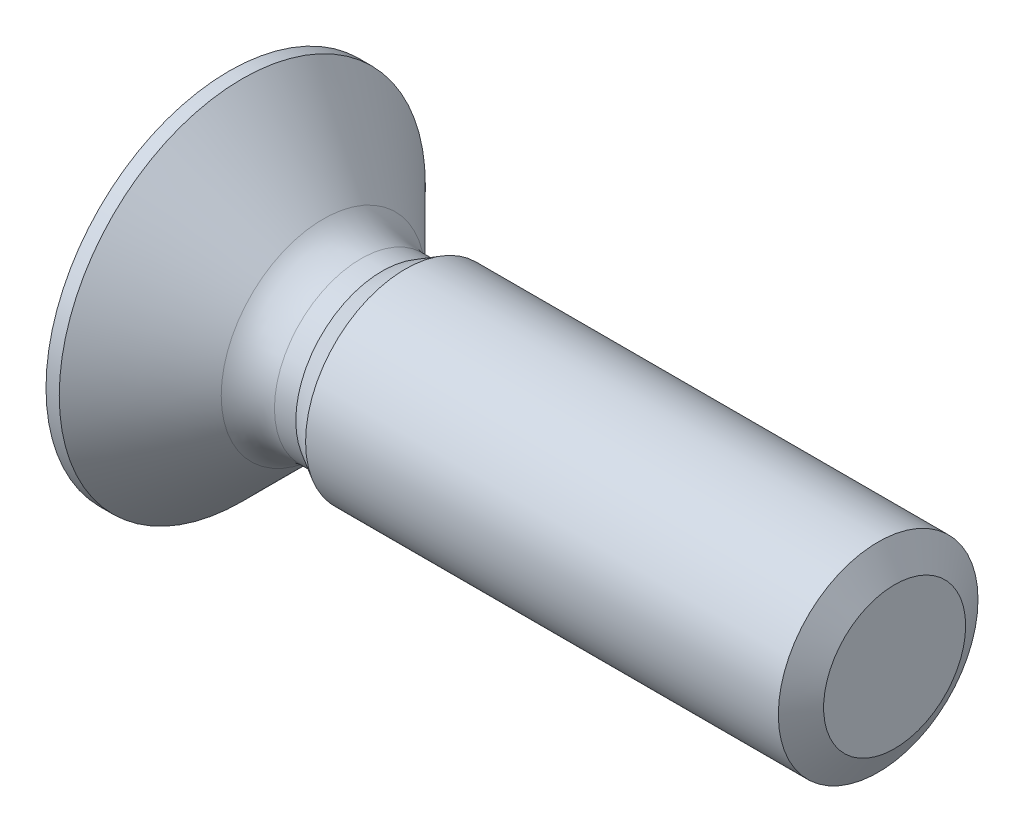
ISO-10303-21;
HEADER;
FILE_DESCRIPTION(('STEP AP214'),'2;1');
FILE_NAME('part.step','',(''),(''),'','','');
FILE_SCHEMA(('AUTOMOTIVE_DESIGN { 1 0 10303 214 1 1 1 1 }'));
ENDSEC;
DATA;
#1=APPLICATION_CONTEXT('core data for automotive mechanical design processes');
#2=APPLICATION_PROTOCOL_DEFINITION('international standard','automotive_design',2000,#1);
#3=PRODUCT_CONTEXT('',#1,'mechanical');
#4=PRODUCT('Part','Part','',(#3));
#5=PRODUCT_RELATED_PRODUCT_CATEGORY('part','',(#4));
#6=PRODUCT_DEFINITION_FORMATION('','',#4);
#7=PRODUCT_DEFINITION_CONTEXT('part definition',#1,'design');
#8=PRODUCT_DEFINITION('design','',#6,#7);
#9=PRODUCT_DEFINITION_SHAPE('','',#8);
#10=(LENGTH_UNIT() NAMED_UNIT(*) SI_UNIT(.MILLI.,.METRE.));
#11=(NAMED_UNIT(*) PLANE_ANGLE_UNIT() SI_UNIT($,.RADIAN.));
#12=(NAMED_UNIT(*) SI_UNIT($,.STERADIAN.) SOLID_ANGLE_UNIT());
#13=UNCERTAINTY_MEASURE_WITH_UNIT(LENGTH_MEASURE(1.E-05),#10,'distance_accuracy_value','');
#14=(GEOMETRIC_REPRESENTATION_CONTEXT(3) GLOBAL_UNCERTAINTY_ASSIGNED_CONTEXT((#13)) GLOBAL_UNIT_ASSIGNED_CONTEXT((#10,
#11,#12)) REPRESENTATION_CONTEXT('',''));
#15=CARTESIAN_POINT('',(0.,0.,0.));
#16=DIRECTION('',(0.,0.,1.));
#17=DIRECTION('',(1.,0.,0.));
#18=AXIS2_PLACEMENT_3D('',#15,#16,#17);
#19=CARTESIAN_POINT('',(0.,0.,0.));
#20=DIRECTION('',(1.,0.,0.));
#21=DIRECTION('',(0.,0.,-1.));
#22=AXIS2_PLACEMENT_3D('',#19,#20,#21);
#23=PLANE('',#22);
#24=CARTESIAN_POINT('',(0.,0.,0.));
#25=DIRECTION('',(-1.,0.,0.));
#26=DIRECTION('',(0.,0.,1.));
#27=AXIS2_PLACEMENT_3D('',#24,#25,#26);
#28=CIRCLE('',#27,2.75);
#29=CARTESIAN_POINT('',(0.,0.,2.75));
#30=VERTEX_POINT('',#29);
#31=EDGE_CURVE('E179',#30,#30,#28,.T.);
#32=ORIENTED_EDGE('',*,*,#31,.T.);
#33=EDGE_LOOP('',(#32));
#34=FACE_BOUND('',#33,.T.);
#35=DIRECTION('',(0.,1.,0.));
#36=VECTOR('',#35,1.);
#37=CARTESIAN_POINT('',(0.,1.6,0.250000000000006));
#38=LINE('',#37,#36);
#39=CARTESIAN_POINT('',(0.,0.25,0.250000000000001));
#40=VERTEX_POINT('',#39);
#41=CARTESIAN_POINT('',(0.,1.6,0.250000000000006));
#42=VERTEX_POINT('',#41);
#43=EDGE_CURVE('E101',#40,#42,#38,.T.);
#44=ORIENTED_EDGE('',*,*,#43,.F.);
#45=DIRECTION('',(0.,0.,-1.));
#46=VECTOR('',#45,1.);
#47=CARTESIAN_POINT('',(0.,0.25,-1.6));
#48=LINE('',#47,#46);
#49=CARTESIAN_POINT('',(0.,0.25,1.6));
#50=VERTEX_POINT('',#49);
#51=EDGE_CURVE('E146',#50,#40,#48,.T.);
#52=ORIENTED_EDGE('',*,*,#51,.F.);
#53=DIRECTION('',(0.,1.,0.));
#54=VECTOR('',#53,1.);
#55=CARTESIAN_POINT('',(0.,0.25,1.6));
#56=LINE('',#55,#54);
#57=CARTESIAN_POINT('',(0.,-0.25,1.6));
#58=VERTEX_POINT('',#57);
#59=EDGE_CURVE('E143',#58,#50,#56,.T.);
#60=ORIENTED_EDGE('',*,*,#59,.F.);
#61=DIRECTION('',(0.,0.,1.));
#62=VECTOR('',#61,1.);
#63=CARTESIAN_POINT('',(0.,-0.25,-1.6));
#64=LINE('',#63,#62);
#65=CARTESIAN_POINT('',(0.,-0.25,0.249999999999999));
#66=VERTEX_POINT('',#65);
#67=EDGE_CURVE('E74',#66,#58,#64,.T.);
#68=ORIENTED_EDGE('',*,*,#67,.F.);
#69=CARTESIAN_POINT('',(0.,-1.6,0.249999999999994));
#70=VERTEX_POINT('',#69);
#71=EDGE_CURVE('E109',#70,#66,#38,.T.);
#72=ORIENTED_EDGE('',*,*,#71,.F.);
#73=DIRECTION('',(0.,0.,1.));
#74=VECTOR('',#73,1.);
#75=CARTESIAN_POINT('',(0.,-1.6,0.249999999999994));
#76=LINE('',#75,#74);
#77=CARTESIAN_POINT('',(0.,-1.6,-0.250000000000006));
#78=VERTEX_POINT('',#77);
#79=EDGE_CURVE('E110',#78,#70,#76,.T.);
#80=ORIENTED_EDGE('',*,*,#79,.F.);
#81=DIRECTION('',(0.,-1.,0.));
#82=VECTOR('',#81,1.);
#83=CARTESIAN_POINT('',(0.,1.6,-0.249999999999994));
#84=LINE('',#83,#82);
#85=CARTESIAN_POINT('',(0.,-0.25,-0.250000000000001));
#86=VERTEX_POINT('',#85);
#87=EDGE_CURVE('E123',#86,#78,#84,.T.);
#88=ORIENTED_EDGE('',*,*,#87,.F.);
#89=CARTESIAN_POINT('',(0.,-0.25,-1.6));
#90=VERTEX_POINT('',#89);
#91=EDGE_CURVE('E140',#90,#86,#64,.T.);
#92=ORIENTED_EDGE('',*,*,#91,.F.);
#93=DIRECTION('',(0.,-1.,0.));
#94=VECTOR('',#93,1.);
#95=CARTESIAN_POINT('',(0.,0.25,-1.6));
#96=LINE('',#95,#94);
#97=CARTESIAN_POINT('',(0.,0.25,-1.6));
#98=VERTEX_POINT('',#97);
#99=EDGE_CURVE('E51',#98,#90,#96,.T.);
#100=ORIENTED_EDGE('',*,*,#99,.F.);
#101=CARTESIAN_POINT('',(0.,0.25,-0.249999999999999));
#102=VERTEX_POINT('',#101);
#103=EDGE_CURVE('E149',#102,#98,#48,.T.);
#104=ORIENTED_EDGE('',*,*,#103,.F.);
#105=CARTESIAN_POINT('',(0.,1.6,-0.249999999999994));
#106=VERTEX_POINT('',#105);
#107=EDGE_CURVE('E122',#106,#102,#84,.T.);
#108=ORIENTED_EDGE('',*,*,#107,.F.);
#109=DIRECTION('',(0.,0.,-1.));
#110=VECTOR('',#109,1.);
#111=CARTESIAN_POINT('',(0.,1.6,0.250000000000006));
#112=LINE('',#111,#110);
#113=EDGE_CURVE('E115',#42,#106,#112,.T.);
#114=ORIENTED_EDGE('',*,*,#113,.F.);
#115=EDGE_LOOP('',(#44,#52,#60,#68,#72,#80,#88,#92,#100,#104,#108,#114));
#116=FACE_BOUND('',#115,.T.);
#117=ADVANCED_FACE('F37',(#34,#116),#23,.F.);
#118=CARTESIAN_POINT('',(2.1,0.,0.));
#119=DIRECTION('',(-0.118212889785112,-0.992988274194944,0.));
#120=DIRECTION('',(0.992988274194944,-0.118212889785112,0.));
#121=AXIS2_PLACEMENT_3D('',#118,#119,#120);
#122=PLANE('',#121);
#123=ORIENTED_EDGE('',*,*,#51,.T.);
#124=DIRECTION('',(0.986122002690152,-0.117395476510732,-0.117395476510733));
#125=VECTOR('',#124,1.);
#126=CARTESIAN_POINT('',(2.1,0.,0.));
#127=LINE('',#126,#125);
#128=CARTESIAN_POINT('',(2.1,0.,0.));
#129=VERTEX_POINT('',#128);
#130=EDGE_CURVE('E80',#40,#129,#127,.T.);
#131=ORIENTED_EDGE('',*,*,#130,.T.);
#132=DIRECTION('',(0.791889207905293,-0.0942725247506301,-0.603344158404032));
#133=VECTOR('',#132,1.);
#134=CARTESIAN_POINT('',(0.,0.25,1.6));
#135=LINE('',#134,#133);
#136=EDGE_CURVE('E60',#50,#129,#135,.T.);
#137=ORIENTED_EDGE('',*,*,#136,.F.);
#138=EDGE_LOOP('',(#123,#131,#137));
#139=FACE_BOUND('',#138,.T.);
#140=ADVANCED_FACE('F195',(#139),#122,.T.);
#141=DIRECTION('',(0.791889207905293,-0.0942725247506301,0.603344158404032));
#142=VECTOR('',#141,1.);
#143=CARTESIAN_POINT('',(0.,0.25,-1.6));
#144=LINE('',#143,#142);
#145=EDGE_CURVE('E145',#98,#129,#144,.T.);
#146=ORIENTED_EDGE('',*,*,#145,.T.);
#147=DIRECTION('',(-0.986122002690152,0.117395476510732,-0.117395476510732));
#148=VECTOR('',#147,1.);
#149=CARTESIAN_POINT('',(2.1,0.,0.));
#150=LINE('',#149,#148);
#151=EDGE_CURVE('E127',#129,#102,#150,.T.);
#152=ORIENTED_EDGE('',*,*,#151,.T.);
#153=ORIENTED_EDGE('',*,*,#103,.T.);
#154=EDGE_LOOP('',(#146,#152,#153));
#155=FACE_BOUND('',#154,.T.);
#156=ADVANCED_FACE('F189',(#155),#122,.T.);
#157=CARTESIAN_POINT('',(2.1,0.,0.));
#158=DIRECTION('',(-0.118212889785112,0.992988274194944,0.));
#159=DIRECTION('',(-0.992988274194944,-0.118212889785112,0.));
#160=AXIS2_PLACEMENT_3D('',#157,#158,#159);
#161=PLANE('',#160);
#162=DIRECTION('',(0.791889207905293,0.0942725247506301,-0.603344158404032));
#163=VECTOR('',#162,1.);
#164=CARTESIAN_POINT('',(0.,-0.25,1.6));
#165=LINE('',#164,#163);
#166=EDGE_CURVE('E139',#58,#129,#165,.T.);
#167=ORIENTED_EDGE('',*,*,#166,.T.);
#168=DIRECTION('',(-0.986122002690152,-0.117395476510732,0.117395476510732));
#169=VECTOR('',#168,1.);
#170=CARTESIAN_POINT('',(2.1,0.,0.));
#171=LINE('',#170,#169);
#172=EDGE_CURVE('E11',#129,#66,#171,.T.);
#173=ORIENTED_EDGE('',*,*,#172,.T.);
#174=ORIENTED_EDGE('',*,*,#67,.T.);
#175=EDGE_LOOP('',(#167,#173,#174));
#176=FACE_BOUND('',#175,.T.);
#177=ADVANCED_FACE('F190',(#176),#161,.T.);
#178=ORIENTED_EDGE('',*,*,#91,.T.);
#179=DIRECTION('',(0.986122002690152,0.117395476510732,0.117395476510733));
#180=VECTOR('',#179,1.);
#181=CARTESIAN_POINT('',(2.1,0.,0.));
#182=LINE('',#181,#180);
#183=EDGE_CURVE('E44',#86,#129,#182,.T.);
#184=ORIENTED_EDGE('',*,*,#183,.T.);
#185=DIRECTION('',(0.791889207905293,0.0942725247506301,0.603344158404032));
#186=VECTOR('',#185,1.);
#187=CARTESIAN_POINT('',(0.,-0.25,-1.6));
#188=LINE('',#187,#186);
#189=EDGE_CURVE('E154',#90,#129,#188,.T.);
#190=ORIENTED_EDGE('',*,*,#189,.F.);
#191=EDGE_LOOP('',(#178,#184,#190));
#192=FACE_BOUND('',#191,.T.);
#193=ADVANCED_FACE('F183',(#192),#161,.T.);
#194=CARTESIAN_POINT('',(0.,0.,0.));
#195=DIRECTION('',(-1.,0.,0.));
#196=DIRECTION('',(0.,0.,1.));
#197=AXIS2_PLACEMENT_3D('',#194,#195,#196);
#198=CYLINDRICAL_SURFACE('',#197,2.75);
#199=ORIENTED_EDGE('',*,*,#31,.F.);
#200=EDGE_LOOP('',(#199));
#201=FACE_BOUND('',#200,.T.);
#202=CARTESIAN_POINT('',(0.199000000000005,0.,0.));
#203=DIRECTION('',(-1.,0.,0.));
#204=DIRECTION('',(0.,0.,1.));
#205=AXIS2_PLACEMENT_3D('',#202,#203,#204);
#206=CIRCLE('',#205,2.75);
#207=CARTESIAN_POINT('',(0.199000000000005,0.,2.75));
#208=VERTEX_POINT('',#207);
#209=EDGE_CURVE('E175',#208,#208,#206,.T.);
#210=ORIENTED_EDGE('',*,*,#209,.T.);
#211=EDGE_LOOP('',(#210));
#212=FACE_BOUND('',#211,.T.);
#213=ADVANCED_FACE('F223',(#201,#212),#198,.T.);
#214=CARTESIAN_POINT('',(1.41568542494924,0.,0.));
#215=DIRECTION('',(-1.,0.,0.));
#216=DIRECTION('',(0.,0.,1.));
#217=AXIS2_PLACEMENT_3D('',#214,#215,#216);
#218=CONICAL_SURFACE('',#217,1.53331457505076,0.78539816339745);
#219=ORIENTED_EDGE('',*,*,#209,.F.);
#220=EDGE_LOOP('',(#219));
#221=FACE_BOUND('',#220,.T.);
#222=CARTESIAN_POINT('',(1.41568542494924,0.,0.));
#223=DIRECTION('',(-1.,0.,0.));
#224=DIRECTION('',(0.,0.,1.));
#225=AXIS2_PLACEMENT_3D('',#222,#223,#224);
#226=CIRCLE('',#225,1.53331457505076);
#227=CARTESIAN_POINT('',(1.41568542494924,0.,1.53331457505076));
#228=VERTEX_POINT('',#227);
#229=EDGE_CURVE('E171',#228,#228,#226,.T.);
#230=ORIENTED_EDGE('',*,*,#229,.T.);
#231=EDGE_LOOP('',(#230));
#232=FACE_BOUND('',#231,.T.);
#233=ADVANCED_FACE('F226',(#221,#232),#218,.T.);
#234=CARTESIAN_POINT('',(1.98137084989848,0.,0.));
#235=DIRECTION('',(-1.,0.,0.));
#236=DIRECTION('',(0.,0.,1.));
#237=AXIS2_PLACEMENT_3D('',#234,#235,#236);
#238=TOROIDAL_SURFACE('',#237,2.099,0.8);
#239=ORIENTED_EDGE('',*,*,#229,.F.);
#240=EDGE_LOOP('',(#239));
#241=FACE_BOUND('',#240,.T.);
#242=CARTESIAN_POINT('',(1.98137084989848,0.,0.));
#243=DIRECTION('',(-1.,0.,0.));
#244=DIRECTION('',(0.,0.,1.));
#245=AXIS2_PLACEMENT_3D('',#242,#243,#244);
#246=CIRCLE('',#245,1.299);
#247=CARTESIAN_POINT('',(1.98137084989848,0.,1.299));
#248=VERTEX_POINT('',#247);
#249=EDGE_CURVE('E168',#248,#248,#246,.T.);
#250=ORIENTED_EDGE('',*,*,#249,.T.);
#251=EDGE_LOOP('',(#250));
#252=FACE_BOUND('',#251,.T.);
#253=ADVANCED_FACE('F231',(#241,#252),#238,.F.);
#254=CARTESIAN_POINT('',(0.,0.,0.));
#255=DIRECTION('',(-1.,0.,0.));
#256=DIRECTION('',(0.,0.,1.));
#257=AXIS2_PLACEMENT_3D('',#254,#255,#256);
#258=CYLINDRICAL_SURFACE('',#257,1.299);
#259=ORIENTED_EDGE('',*,*,#249,.F.);
#260=EDGE_LOOP('',(#259));
#261=FACE_BOUND('',#260,.T.);
#262=CARTESIAN_POINT('',(2.30185778767866,0.,0.));
#263=DIRECTION('',(-1.,0.,0.));
#264=DIRECTION('',(0.,0.,1.));
#265=AXIS2_PLACEMENT_3D('',#262,#263,#264);
#266=CIRCLE('',#265,1.299);
#267=CARTESIAN_POINT('',(2.30185778767866,0.,1.299));
#268=VERTEX_POINT('',#267);
#269=EDGE_CURVE('E165',#268,#268,#266,.T.);
#270=ORIENTED_EDGE('',*,*,#269,.T.);
#271=EDGE_LOOP('',(#270));
#272=FACE_BOUND('',#271,.T.);
#273=ADVANCED_FACE('F237',(#261,#272),#258,.T.);
#274=CARTESIAN_POINT('',(2.65,0.,0.));
#275=DIRECTION('',(1.,0.,0.));
#276=DIRECTION('',(0.,0.,-1.));
#277=AXIS2_PLACEMENT_3D('',#274,#275,#276);
#278=CONICAL_SURFACE('',#277,1.5,0.5235987755983);
#279=ORIENTED_EDGE('',*,*,#269,.F.);
#280=EDGE_LOOP('',(#279));
#281=FACE_BOUND('',#280,.T.);
#282=CARTESIAN_POINT('',(2.65,0.,0.));
#283=DIRECTION('',(-1.,0.,0.));
#284=DIRECTION('',(0.,0.,1.));
#285=AXIS2_PLACEMENT_3D('',#282,#283,#284);
#286=CIRCLE('',#285,1.5);
#287=CARTESIAN_POINT('',(2.65,0.,1.5));
#288=VERTEX_POINT('',#287);
#289=EDGE_CURVE('E162',#288,#288,#286,.T.);
#290=ORIENTED_EDGE('',*,*,#289,.T.);
#291=EDGE_LOOP('',(#290));
#292=FACE_BOUND('',#291,.T.);
#293=ADVANCED_FACE('F243',(#281,#292),#278,.T.);
#294=CARTESIAN_POINT('',(0.,0.,0.));
#295=DIRECTION('',(-1.,0.,0.));
#296=DIRECTION('',(0.,0.,1.));
#297=AXIS2_PLACEMENT_3D('',#294,#295,#296);
#298=CYLINDRICAL_SURFACE('',#297,1.5);
#299=CARTESIAN_POINT('',(9.75270800287124,0.,0.));
#300=DIRECTION('',(1.,0.,0.));
#301=DIRECTION('',(0.,0.,-1.));
#302=AXIS2_PLACEMENT_3D('',#299,#300,#301);
#303=CIRCLE('',#302,1.5);
#304=CARTESIAN_POINT('',(9.75270800287124,0.,-1.5));
#305=VERTEX_POINT('',#304);
#306=EDGE_CURVE('E159',#305,#305,#303,.T.);
#307=ORIENTED_EDGE('',*,*,#306,.F.);
#308=EDGE_LOOP('',(#307));
#309=FACE_BOUND('',#308,.T.);
#310=ORIENTED_EDGE('',*,*,#289,.F.);
#311=EDGE_LOOP('',(#310));
#312=FACE_BOUND('',#311,.T.);
#313=ADVANCED_FACE('F249',(#309,#312),#298,.T.);
#314=CARTESIAN_POINT('',(9.75270800287124,0.,0.));
#315=DIRECTION('',(-1.,0.,0.));
#316=DIRECTION('',(0.,0.,1.));
#317=AXIS2_PLACEMENT_3D('',#314,#315,#316);
#318=CONICAL_SURFACE('',#317,1.5,1.05188801855135);
#319=CARTESIAN_POINT('',(10.,0.,0.));
#320=DIRECTION('',(1.,0.,0.));
#321=DIRECTION('',(0.,0.,-1.));
#322=AXIS2_PLACEMENT_3D('',#319,#320,#321);
#323=CIRCLE('',#322,1.067);
#324=CARTESIAN_POINT('',(10.,0.,-1.067));
#325=VERTEX_POINT('',#324);
#326=EDGE_CURVE('E148',#325,#325,#323,.T.);
#327=ORIENTED_EDGE('',*,*,#326,.F.);
#328=EDGE_LOOP('',(#327));
#329=FACE_BOUND('',#328,.T.);
#330=ORIENTED_EDGE('',*,*,#306,.T.);
#331=EDGE_LOOP('',(#330));
#332=FACE_BOUND('',#331,.T.);
#333=ADVANCED_FACE('F254',(#329,#332),#318,.T.);
#334=CARTESIAN_POINT('',(10.,1.5,0.));
#335=DIRECTION('',(-1.,0.,0.));
#336=DIRECTION('',(0.,0.,1.));
#337=AXIS2_PLACEMENT_3D('',#334,#335,#336);
#338=PLANE('',#337);
#339=ORIENTED_EDGE('',*,*,#326,.T.);
#340=EDGE_LOOP('',(#339));
#341=FACE_BOUND('',#340,.T.);
#342=ADVANCED_FACE('F260',(#341),#338,.F.);
#343=CARTESIAN_POINT('',(0.,0.25,-1.6));
#344=DIRECTION('',(0.606043215262856,0.,-0.795431720032499));
#345=DIRECTION('',(-0.795431720032499,0.,-0.606043215262856));
#346=AXIS2_PLACEMENT_3D('',#343,#344,#345);
#347=PLANE('',#346);
#348=ORIENTED_EDGE('',*,*,#145,.F.);
#349=ORIENTED_EDGE('',*,*,#99,.T.);
#350=ORIENTED_EDGE('',*,*,#189,.T.);
#351=EDGE_LOOP('',(#348,#349,#350));
#352=FACE_BOUND('',#351,.T.);
#353=ADVANCED_FACE('F187',(#352),#347,.F.);
#354=CARTESIAN_POINT('',(0.,-0.25,1.6));
#355=DIRECTION('',(0.606043215262856,0.,0.795431720032499));
#356=DIRECTION('',(0.795431720032499,0.,-0.606043215262856));
#357=AXIS2_PLACEMENT_3D('',#354,#355,#356);
#358=PLANE('',#357);
#359=ORIENTED_EDGE('',*,*,#166,.F.);
#360=ORIENTED_EDGE('',*,*,#59,.T.);
#361=ORIENTED_EDGE('',*,*,#136,.T.);
#362=EDGE_LOOP('',(#359,#360,#361));
#363=FACE_BOUND('',#362,.T.);
#364=ADVANCED_FACE('F194',(#363),#358,.F.);
#365=CARTESIAN_POINT('',(2.1,0.,0.));
#366=DIRECTION('',(-0.118212889785112,0.,-0.992988274194944));
#367=DIRECTION('',(0.992988274194944,0.,-0.118212889785112));
#368=AXIS2_PLACEMENT_3D('',#365,#366,#367);
#369=PLANE('',#368);
#370=DIRECTION('',(0.791889207905293,0.603344158404033,-0.0942725247506279));
#371=VECTOR('',#370,1.);
#372=CARTESIAN_POINT('',(0.,-1.6,0.249999999999994));
#373=LINE('',#372,#371);
#374=EDGE_CURVE('E119',#70,#129,#373,.T.);
#375=ORIENTED_EDGE('',*,*,#374,.F.);
#376=ORIENTED_EDGE('',*,*,#71,.T.);
#377=ORIENTED_EDGE('',*,*,#172,.F.);
#378=EDGE_LOOP('',(#375,#376,#377));
#379=FACE_BOUND('',#378,.T.);
#380=ADVANCED_FACE('F199',(#379),#369,.T.);
#381=CARTESIAN_POINT('',(2.1,0.,0.));
#382=DIRECTION('',(-0.118212889785112,0.,0.992988274194944));
#383=DIRECTION('',(-0.992988274194944,0.,-0.118212889785112));
#384=AXIS2_PLACEMENT_3D('',#381,#382,#383);
#385=PLANE('',#384);
#386=ORIENTED_EDGE('',*,*,#87,.T.);
#387=DIRECTION('',(0.791889207905293,0.603344158404032,0.0942725247506322));
#388=VECTOR('',#387,1.);
#389=CARTESIAN_POINT('',(0.,-1.6,-0.250000000000006));
#390=LINE('',#389,#388);
#391=EDGE_CURVE('E133',#78,#129,#390,.T.);
#392=ORIENTED_EDGE('',*,*,#391,.T.);
#393=ORIENTED_EDGE('',*,*,#183,.F.);
#394=EDGE_LOOP('',(#386,#392,#393));
#395=FACE_BOUND('',#394,.T.);
#396=ADVANCED_FACE('F203',(#395),#385,.T.);
#397=CARTESIAN_POINT('',(0.,-1.6,-0.250000000000006));
#398=DIRECTION('',(0.606043215262856,-0.795431720032499,0.));
#399=DIRECTION('',(0.795431720032499,0.606043215262856,0.));
#400=AXIS2_PLACEMENT_3D('',#397,#398,#399);
#401=PLANE('',#400);
#402=ORIENTED_EDGE('',*,*,#391,.F.);
#403=ORIENTED_EDGE('',*,*,#79,.T.);
#404=ORIENTED_EDGE('',*,*,#374,.T.);
#405=EDGE_LOOP('',(#402,#403,#404));
#406=FACE_BOUND('',#405,.T.);
#407=ADVANCED_FACE('F202',(#406),#401,.F.);
#408=ORIENTED_EDGE('',*,*,#43,.T.);
#409=DIRECTION('',(0.791889207905293,-0.603344158404032,-0.0942725247506322));
#410=VECTOR('',#409,1.);
#411=CARTESIAN_POINT('',(0.,1.6,0.250000000000006));
#412=LINE('',#411,#410);
#413=EDGE_CURVE('E104',#42,#129,#412,.T.);
#414=ORIENTED_EDGE('',*,*,#413,.T.);
#415=ORIENTED_EDGE('',*,*,#130,.F.);
#416=EDGE_LOOP('',(#408,#414,#415));
#417=FACE_BOUND('',#416,.T.);
#418=ADVANCED_FACE('F103',(#417),#369,.T.);
#419=DIRECTION('',(0.791889207905293,-0.603344158404033,0.0942725247506279));
#420=VECTOR('',#419,1.);
#421=CARTESIAN_POINT('',(0.,1.6,-0.249999999999994));
#422=LINE('',#421,#420);
#423=EDGE_CURVE('E117',#106,#129,#422,.T.);
#424=ORIENTED_EDGE('',*,*,#423,.F.);
#425=ORIENTED_EDGE('',*,*,#107,.T.);
#426=ORIENTED_EDGE('',*,*,#151,.F.);
#427=EDGE_LOOP('',(#424,#425,#426));
#428=FACE_BOUND('',#427,.T.);
#429=ADVANCED_FACE('F206',(#428),#385,.T.);
#430=CARTESIAN_POINT('',(0.,1.6,0.250000000000006));
#431=DIRECTION('',(0.606043215262856,0.795431720032499,0.));
#432=DIRECTION('',(-0.795431720032499,0.606043215262856,0.));
#433=AXIS2_PLACEMENT_3D('',#430,#431,#432);
#434=PLANE('',#433);
#435=ORIENTED_EDGE('',*,*,#413,.F.);
#436=ORIENTED_EDGE('',*,*,#113,.T.);
#437=ORIENTED_EDGE('',*,*,#423,.T.);
#438=EDGE_LOOP('',(#435,#436,#437));
#439=FACE_BOUND('',#438,.T.);
#440=ADVANCED_FACE('F114',(#439),#434,.F.);
#441=CLOSED_SHELL('',(#117,#140,#156,#177,#193,#213,#233,#253,#273,#293,#313,#333,#342,#353,
#364,#380,#396,#407,#418,#429,#440));
#442=MANIFOLD_SOLID_BREP('B2',#441);
#443=ADVANCED_BREP_SHAPE_REPRESENTATION('',(#18,#442),#14);
#444=SHAPE_DEFINITION_REPRESENTATION(#9,#443);
ENDSEC;
END-ISO-10303-21;
